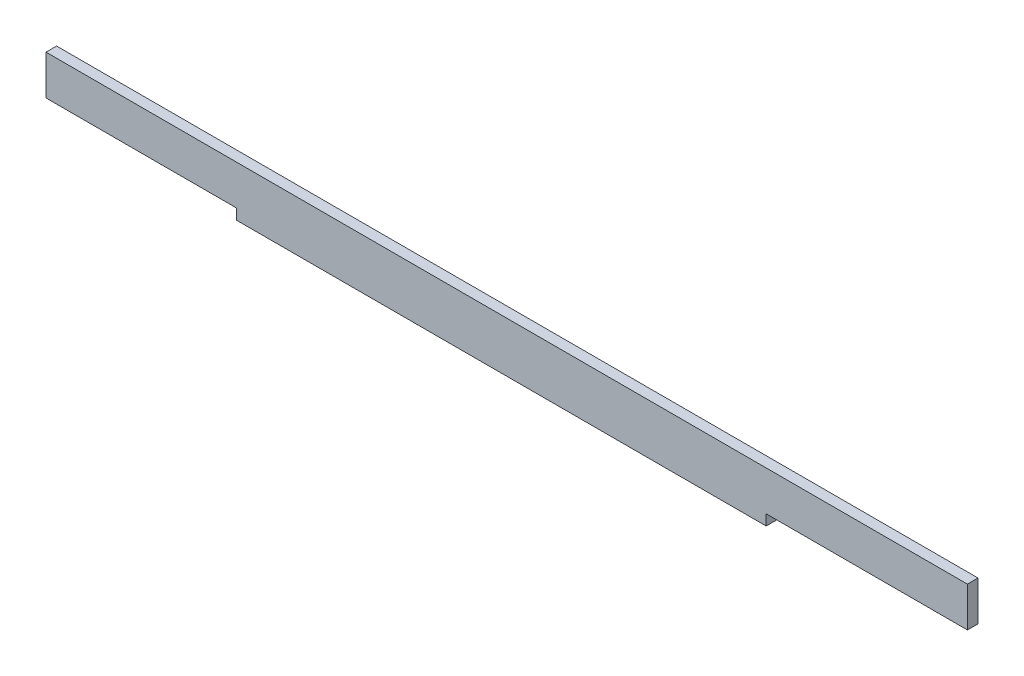
ISO-10303-21;
HEADER;
FILE_DESCRIPTION(('STEP AP214'),'2;1');
FILE_NAME('part.step','',(''),(''),'','','');
FILE_SCHEMA(('AUTOMOTIVE_DESIGN { 1 0 10303 214 1 1 1 1 }'));
ENDSEC;
DATA;
#1=APPLICATION_CONTEXT('core data for automotive mechanical design processes');
#2=APPLICATION_PROTOCOL_DEFINITION('international standard','automotive_design',2000,#1);
#3=PRODUCT_CONTEXT('',#1,'mechanical');
#4=PRODUCT('Part','Part','',(#3));
#5=PRODUCT_RELATED_PRODUCT_CATEGORY('part','',(#4));
#6=PRODUCT_DEFINITION_FORMATION('','',#4);
#7=PRODUCT_DEFINITION_CONTEXT('part definition',#1,'design');
#8=PRODUCT_DEFINITION('design','',#6,#7);
#9=PRODUCT_DEFINITION_SHAPE('','',#8);
#10=(LENGTH_UNIT() NAMED_UNIT(*) SI_UNIT(.MILLI.,.METRE.));
#11=(NAMED_UNIT(*) PLANE_ANGLE_UNIT() SI_UNIT($,.RADIAN.));
#12=(NAMED_UNIT(*) SI_UNIT($,.STERADIAN.) SOLID_ANGLE_UNIT());
#13=UNCERTAINTY_MEASURE_WITH_UNIT(LENGTH_MEASURE(1.E-05),#10,'distance_accuracy_value','');
#14=(GEOMETRIC_REPRESENTATION_CONTEXT(3) GLOBAL_UNCERTAINTY_ASSIGNED_CONTEXT((#13)) GLOBAL_UNIT_ASSIGNED_CONTEXT((#10,
#11,#12)) REPRESENTATION_CONTEXT('',''));
#15=CARTESIAN_POINT('',(0.,0.,0.));
#16=DIRECTION('',(0.,0.,1.));
#17=DIRECTION('',(1.,0.,0.));
#18=AXIS2_PLACEMENT_3D('',#15,#16,#17);
#19=CARTESIAN_POINT('',(-171.636958624373,16.5461982804666,4.));
#20=DIRECTION('',(1.,0.,0.));
#21=DIRECTION('',(0.,0.,-1.));
#22=AXIS2_PLACEMENT_3D('',#19,#20,#21);
#23=PLANE('',#22);
#24=DIRECTION('',(0.,-1.,0.));
#25=VECTOR('',#24,1.);
#26=CARTESIAN_POINT('',(-171.636958624373,16.5461982804666,0.));
#27=LINE('',#26,#25);
#28=CARTESIAN_POINT('',(-171.636958624373,16.5461982804666,0.));
#29=VERTEX_POINT('',#28);
#30=CARTESIAN_POINT('',(-171.636958624373,1.54619828046665,0.));
#31=VERTEX_POINT('',#30);
#32=EDGE_CURVE('E150',#29,#31,#27,.T.);
#33=ORIENTED_EDGE('',*,*,#32,.T.);
#34=DIRECTION('',(0.,0.,-1.));
#35=VECTOR('',#34,1.);
#36=CARTESIAN_POINT('',(-171.636958624373,1.54619828046665,4.));
#37=LINE('',#36,#35);
#38=CARTESIAN_POINT('',(-171.636958624373,1.54619828046665,4.));
#39=VERTEX_POINT('',#38);
#40=EDGE_CURVE('E11',#39,#31,#37,.T.);
#41=ORIENTED_EDGE('',*,*,#40,.F.);
#42=DIRECTION('',(0.,-1.,0.));
#43=VECTOR('',#42,1.);
#44=CARTESIAN_POINT('',(-171.636958624373,16.5461982804666,4.));
#45=LINE('',#44,#43);
#46=CARTESIAN_POINT('',(-171.636958624373,16.5461982804666,4.));
#47=VERTEX_POINT('',#46);
#48=EDGE_CURVE('E172',#47,#39,#45,.T.);
#49=ORIENTED_EDGE('',*,*,#48,.F.);
#50=DIRECTION('',(0.,0.,-1.));
#51=VECTOR('',#50,1.);
#52=CARTESIAN_POINT('',(-171.636958624373,16.5461982804666,4.));
#53=LINE('',#52,#51);
#54=EDGE_CURVE('E146',#47,#29,#53,.T.);
#55=ORIENTED_EDGE('',*,*,#54,.T.);
#56=EDGE_LOOP('',(#33,#41,#49,#55));
#57=FACE_BOUND('',#56,.T.);
#58=ADVANCED_FACE('F49',(#57),#23,.F.);
#59=CARTESIAN_POINT('',(-171.636958624373,1.54619828046665,4.));
#60=DIRECTION('',(0.,1.,0.));
#61=DIRECTION('',(0.,0.,1.));
#62=AXIS2_PLACEMENT_3D('',#59,#60,#61);
#63=PLANE('',#62);
#64=DIRECTION('',(1.,0.,0.));
#65=VECTOR('',#64,1.);
#66=CARTESIAN_POINT('',(-171.636958624373,1.54619828046665,0.));
#67=LINE('',#66,#65);
#68=CARTESIAN_POINT('',(-99.6369586243733,1.54619828046665,0.));
#69=VERTEX_POINT('',#68);
#70=EDGE_CURVE('E154',#31,#69,#67,.T.);
#71=ORIENTED_EDGE('',*,*,#70,.T.);
#72=DIRECTION('',(0.,0.,-1.));
#73=VECTOR('',#72,1.);
#74=CARTESIAN_POINT('',(-99.6369586243733,1.54619828046665,4.));
#75=LINE('',#74,#73);
#76=CARTESIAN_POINT('',(-99.6369586243733,1.54619828046665,4.));
#77=VERTEX_POINT('',#76);
#78=EDGE_CURVE('E58',#77,#69,#75,.T.);
#79=ORIENTED_EDGE('',*,*,#78,.F.);
#80=DIRECTION('',(1.,0.,0.));
#81=VECTOR('',#80,1.);
#82=CARTESIAN_POINT('',(-171.636958624373,1.54619828046665,4.));
#83=LINE('',#82,#81);
#84=EDGE_CURVE('E109',#39,#77,#83,.T.);
#85=ORIENTED_EDGE('',*,*,#84,.F.);
#86=ORIENTED_EDGE('',*,*,#40,.T.);
#87=EDGE_LOOP('',(#71,#79,#85,#86));
#88=FACE_BOUND('',#87,.T.);
#89=ADVANCED_FACE('F218',(#88),#63,.F.);
#90=CARTESIAN_POINT('',(-99.6369586243733,1.54619828046665,4.));
#91=DIRECTION('',(1.,0.,0.));
#92=DIRECTION('',(0.,0.,-1.));
#93=AXIS2_PLACEMENT_3D('',#90,#91,#92);
#94=PLANE('',#93);
#95=DIRECTION('',(0.,-1.,0.));
#96=VECTOR('',#95,1.);
#97=CARTESIAN_POINT('',(-99.6369586243733,1.54619828046665,0.));
#98=LINE('',#97,#96);
#99=CARTESIAN_POINT('',(-99.6369586243733,-2.45380171953336,0.));
#100=VERTEX_POINT('',#99);
#101=EDGE_CURVE('E157',#69,#100,#98,.T.);
#102=ORIENTED_EDGE('',*,*,#101,.T.);
#103=DIRECTION('',(0.,0.,-1.));
#104=VECTOR('',#103,1.);
#105=CARTESIAN_POINT('',(-99.6369586243733,-2.45380171953336,4.));
#106=LINE('',#105,#104);
#107=CARTESIAN_POINT('',(-99.6369586243733,-2.45380171953336,4.));
#108=VERTEX_POINT('',#107);
#109=EDGE_CURVE('E183',#108,#100,#106,.T.);
#110=ORIENTED_EDGE('',*,*,#109,.F.);
#111=DIRECTION('',(0.,-1.,0.));
#112=VECTOR('',#111,1.);
#113=CARTESIAN_POINT('',(-99.6369586243733,1.54619828046665,4.));
#114=LINE('',#113,#112);
#115=EDGE_CURVE('E193',#77,#108,#114,.T.);
#116=ORIENTED_EDGE('',*,*,#115,.F.);
#117=ORIENTED_EDGE('',*,*,#78,.T.);
#118=EDGE_LOOP('',(#102,#110,#116,#117));
#119=FACE_BOUND('',#118,.T.);
#120=ADVANCED_FACE('F191',(#119),#94,.F.);
#121=CARTESIAN_POINT('',(-99.6369586243733,-2.45380171953336,4.));
#122=DIRECTION('',(0.,1.,0.));
#123=DIRECTION('',(0.,0.,1.));
#124=AXIS2_PLACEMENT_3D('',#121,#122,#123);
#125=PLANE('',#124);
#126=DIRECTION('',(1.,0.,0.));
#127=VECTOR('',#126,1.);
#128=CARTESIAN_POINT('',(-99.6369586243733,-2.45380171953336,0.));
#129=LINE('',#128,#127);
#130=CARTESIAN_POINT('',(100.363041375627,-2.45380171953336,0.));
#131=VERTEX_POINT('',#130);
#132=EDGE_CURVE('E160',#100,#131,#129,.T.);
#133=ORIENTED_EDGE('',*,*,#132,.T.);
#134=DIRECTION('',(0.,0.,-1.));
#135=VECTOR('',#134,1.);
#136=CARTESIAN_POINT('',(100.363041375627,-2.45380171953336,4.));
#137=LINE('',#136,#135);
#138=CARTESIAN_POINT('',(100.363041375627,-2.45380171953336,4.));
#139=VERTEX_POINT('',#138);
#140=EDGE_CURVE('E179',#139,#131,#137,.T.);
#141=ORIENTED_EDGE('',*,*,#140,.F.);
#142=DIRECTION('',(1.,0.,0.));
#143=VECTOR('',#142,1.);
#144=CARTESIAN_POINT('',(-99.6369586243733,-2.45380171953336,4.));
#145=LINE('',#144,#143);
#146=EDGE_CURVE('E206',#108,#139,#145,.T.);
#147=ORIENTED_EDGE('',*,*,#146,.F.);
#148=ORIENTED_EDGE('',*,*,#109,.T.);
#149=EDGE_LOOP('',(#133,#141,#147,#148));
#150=FACE_BOUND('',#149,.T.);
#151=ADVANCED_FACE('F201',(#150),#125,.F.);
#152=CARTESIAN_POINT('',(100.363041375627,1.54619828046665,4.));
#153=DIRECTION('',(-1.,0.,0.));
#154=DIRECTION('',(0.,0.,1.));
#155=AXIS2_PLACEMENT_3D('',#152,#153,#154);
#156=PLANE('',#155);
#157=DIRECTION('',(0.,1.,0.));
#158=VECTOR('',#157,1.);
#159=CARTESIAN_POINT('',(100.363041375627,1.54619828046665,0.));
#160=LINE('',#159,#158);
#161=CARTESIAN_POINT('',(100.363041375627,1.54619828046665,0.));
#162=VERTEX_POINT('',#161);
#163=EDGE_CURVE('E163',#131,#162,#160,.T.);
#164=ORIENTED_EDGE('',*,*,#163,.T.);
#165=DIRECTION('',(0.,0.,-1.));
#166=VECTOR('',#165,1.);
#167=CARTESIAN_POINT('',(100.363041375627,1.54619828046665,4.));
#168=LINE('',#167,#166);
#169=CARTESIAN_POINT('',(100.363041375627,1.54619828046665,4.));
#170=VERTEX_POINT('',#169);
#171=EDGE_CURVE('E139',#170,#162,#168,.T.);
#172=ORIENTED_EDGE('',*,*,#171,.F.);
#173=DIRECTION('',(0.,1.,0.));
#174=VECTOR('',#173,1.);
#175=CARTESIAN_POINT('',(100.363041375627,1.54619828046665,4.));
#176=LINE('',#175,#174);
#177=EDGE_CURVE('E128',#139,#170,#176,.T.);
#178=ORIENTED_EDGE('',*,*,#177,.F.);
#179=ORIENTED_EDGE('',*,*,#140,.T.);
#180=EDGE_LOOP('',(#164,#172,#178,#179));
#181=FACE_BOUND('',#180,.T.);
#182=ADVANCED_FACE('F204',(#181),#156,.F.);
#183=CARTESIAN_POINT('',(100.363041375627,1.54619828046665,4.));
#184=DIRECTION('',(0.,1.,0.));
#185=DIRECTION('',(-1.,0.,0.));
#186=AXIS2_PLACEMENT_3D('',#183,#184,#185);
#187=PLANE('',#186);
#188=DIRECTION('',(1.,0.,0.));
#189=VECTOR('',#188,1.);
#190=CARTESIAN_POINT('',(100.363041375627,1.54619828046665,0.));
#191=LINE('',#190,#189);
#192=CARTESIAN_POINT('',(176.363041375627,1.54619828046665,0.));
#193=VERTEX_POINT('',#192);
#194=EDGE_CURVE('E137',#162,#193,#191,.T.);
#195=ORIENTED_EDGE('',*,*,#194,.T.);
#196=DIRECTION('',(0.,0.,-1.));
#197=VECTOR('',#196,1.);
#198=CARTESIAN_POINT('',(176.363041375627,1.54619828046665,4.));
#199=LINE('',#198,#197);
#200=CARTESIAN_POINT('',(176.363041375627,1.54619828046665,4.));
#201=VERTEX_POINT('',#200);
#202=EDGE_CURVE('E134',#201,#193,#199,.T.);
#203=ORIENTED_EDGE('',*,*,#202,.F.);
#204=DIRECTION('',(1.,0.,0.));
#205=VECTOR('',#204,1.);
#206=CARTESIAN_POINT('',(100.363041375627,1.54619828046665,4.));
#207=LINE('',#206,#205);
#208=EDGE_CURVE('E122',#170,#201,#207,.T.);
#209=ORIENTED_EDGE('',*,*,#208,.F.);
#210=ORIENTED_EDGE('',*,*,#171,.T.);
#211=EDGE_LOOP('',(#195,#203,#209,#210));
#212=FACE_BOUND('',#211,.T.);
#213=ADVANCED_FACE('F135',(#212),#187,.F.);
#214=CARTESIAN_POINT('',(176.363041375627,16.5461982804666,4.));
#215=DIRECTION('',(-1.,0.,0.));
#216=DIRECTION('',(0.,0.,1.));
#217=AXIS2_PLACEMENT_3D('',#214,#215,#216);
#218=PLANE('',#217);
#219=DIRECTION('',(0.,1.,0.));
#220=VECTOR('',#219,1.);
#221=CARTESIAN_POINT('',(176.363041375627,16.5461982804666,0.));
#222=LINE('',#221,#220);
#223=CARTESIAN_POINT('',(176.363041375627,16.5461982804666,0.));
#224=VERTEX_POINT('',#223);
#225=EDGE_CURVE('E95',#193,#224,#222,.T.);
#226=ORIENTED_EDGE('',*,*,#225,.T.);
#227=DIRECTION('',(0.,0.,-1.));
#228=VECTOR('',#227,1.);
#229=CARTESIAN_POINT('',(176.363041375627,16.5461982804666,4.));
#230=LINE('',#229,#228);
#231=CARTESIAN_POINT('',(176.363041375627,16.5461982804666,4.));
#232=VERTEX_POINT('',#231);
#233=EDGE_CURVE('E140',#232,#224,#230,.T.);
#234=ORIENTED_EDGE('',*,*,#233,.F.);
#235=DIRECTION('',(0.,1.,0.));
#236=VECTOR('',#235,1.);
#237=CARTESIAN_POINT('',(176.363041375627,16.5461982804666,4.));
#238=LINE('',#237,#236);
#239=EDGE_CURVE('E126',#201,#232,#238,.T.);
#240=ORIENTED_EDGE('',*,*,#239,.F.);
#241=ORIENTED_EDGE('',*,*,#202,.T.);
#242=EDGE_LOOP('',(#226,#234,#240,#241));
#243=FACE_BOUND('',#242,.T.);
#244=ADVANCED_FACE('F142',(#243),#218,.F.);
#245=CARTESIAN_POINT('',(176.363041375627,16.5461982804666,4.));
#246=DIRECTION('',(0.,-1.,0.));
#247=DIRECTION('',(1.,0.,0.));
#248=AXIS2_PLACEMENT_3D('',#245,#246,#247);
#249=PLANE('',#248);
#250=DIRECTION('',(-1.,0.,0.));
#251=VECTOR('',#250,1.);
#252=CARTESIAN_POINT('',(176.363041375627,16.5461982804666,0.));
#253=LINE('',#252,#251);
#254=EDGE_CURVE('E101',#224,#29,#253,.T.);
#255=ORIENTED_EDGE('',*,*,#254,.T.);
#256=ORIENTED_EDGE('',*,*,#54,.F.);
#257=DIRECTION('',(-1.,0.,0.));
#258=VECTOR('',#257,1.);
#259=CARTESIAN_POINT('',(176.363041375627,16.5461982804666,4.));
#260=LINE('',#259,#258);
#261=EDGE_CURVE('E66',#232,#47,#260,.T.);
#262=ORIENTED_EDGE('',*,*,#261,.F.);
#263=ORIENTED_EDGE('',*,*,#233,.T.);
#264=EDGE_LOOP('',(#255,#256,#262,#263));
#265=FACE_BOUND('',#264,.T.);
#266=ADVANCED_FACE('F234',(#265),#249,.F.);
#267=CARTESIAN_POINT('',(0.,0.,4.));
#268=DIRECTION('',(0.,0.,1.));
#269=DIRECTION('',(1.,0.,0.));
#270=AXIS2_PLACEMENT_3D('',#267,#268,#269);
#271=PLANE('',#270);
#272=ORIENTED_EDGE('',*,*,#48,.T.);
#273=ORIENTED_EDGE('',*,*,#84,.T.);
#274=ORIENTED_EDGE('',*,*,#115,.T.);
#275=ORIENTED_EDGE('',*,*,#146,.T.);
#276=ORIENTED_EDGE('',*,*,#177,.T.);
#277=ORIENTED_EDGE('',*,*,#208,.T.);
#278=ORIENTED_EDGE('',*,*,#239,.T.);
#279=ORIENTED_EDGE('',*,*,#261,.T.);
#280=EDGE_LOOP('',(#272,#273,#274,#275,#276,#277,#278,#279));
#281=FACE_BOUND('',#280,.T.);
#282=ADVANCED_FACE('F124',(#281),#271,.T.);
#283=CARTESIAN_POINT('',(0.,0.,0.));
#284=DIRECTION('',(0.,0.,1.));
#285=DIRECTION('',(1.,0.,0.));
#286=AXIS2_PLACEMENT_3D('',#283,#284,#285);
#287=PLANE('',#286);
#288=ORIENTED_EDGE('',*,*,#32,.F.);
#289=ORIENTED_EDGE('',*,*,#254,.F.);
#290=ORIENTED_EDGE('',*,*,#225,.F.);
#291=ORIENTED_EDGE('',*,*,#194,.F.);
#292=ORIENTED_EDGE('',*,*,#163,.F.);
#293=ORIENTED_EDGE('',*,*,#132,.F.);
#294=ORIENTED_EDGE('',*,*,#101,.F.);
#295=ORIENTED_EDGE('',*,*,#70,.F.);
#296=EDGE_LOOP('',(#288,#289,#290,#291,#292,#293,#294,#295));
#297=FACE_BOUND('',#296,.T.);
#298=ADVANCED_FACE('F197',(#297),#287,.F.);
#299=CLOSED_SHELL('',(#58,#89,#120,#151,#182,#213,#244,#266,#282,#298));
#300=MANIFOLD_SOLID_BREP('B2',#299);
#301=ADVANCED_BREP_SHAPE_REPRESENTATION('',(#18,#300),#14);
#302=SHAPE_DEFINITION_REPRESENTATION(#9,#301);
ENDSEC;
END-ISO-10303-21;
